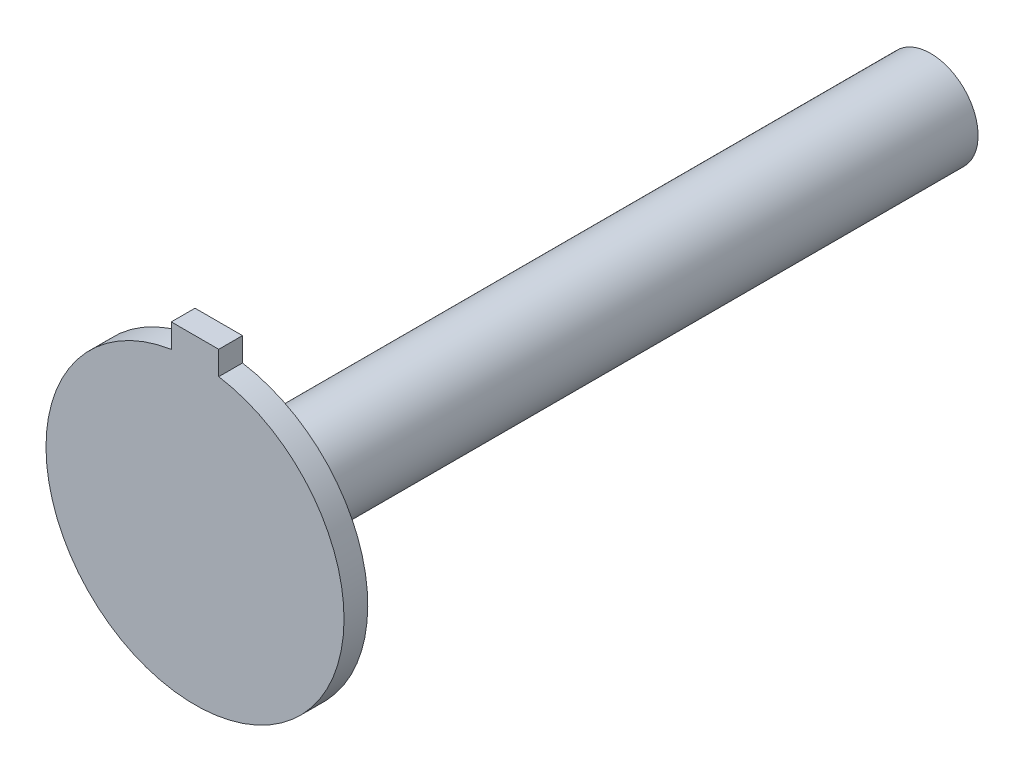
ISO-10303-21;
HEADER;
FILE_DESCRIPTION(('STEP AP214'),'2;1');
FILE_NAME('part.step','',(''),(''),'','','');
FILE_SCHEMA(('AUTOMOTIVE_DESIGN { 1 0 10303 214 1 1 1 1 }'));
ENDSEC;
DATA;
#1=APPLICATION_CONTEXT('core data for automotive mechanical design processes');
#2=APPLICATION_PROTOCOL_DEFINITION('international standard','automotive_design',2000,#1);
#3=PRODUCT_CONTEXT('',#1,'mechanical');
#4=PRODUCT('Part','Part','',(#3));
#5=PRODUCT_RELATED_PRODUCT_CATEGORY('part','',(#4));
#6=PRODUCT_DEFINITION_FORMATION('','',#4);
#7=PRODUCT_DEFINITION_CONTEXT('part definition',#1,'design');
#8=PRODUCT_DEFINITION('design','',#6,#7);
#9=PRODUCT_DEFINITION_SHAPE('','',#8);
#10=(LENGTH_UNIT() NAMED_UNIT(*) SI_UNIT(.MILLI.,.METRE.));
#11=(NAMED_UNIT(*) PLANE_ANGLE_UNIT() SI_UNIT($,.RADIAN.));
#12=(NAMED_UNIT(*) SI_UNIT($,.STERADIAN.) SOLID_ANGLE_UNIT());
#13=UNCERTAINTY_MEASURE_WITH_UNIT(LENGTH_MEASURE(1.E-05),#10,'distance_accuracy_value','');
#14=(GEOMETRIC_REPRESENTATION_CONTEXT(3) GLOBAL_UNCERTAINTY_ASSIGNED_CONTEXT((#13)) GLOBAL_UNIT_ASSIGNED_CONTEXT((#10,
#11,#12)) REPRESENTATION_CONTEXT('',''));
#15=CARTESIAN_POINT('',(0.,0.,0.));
#16=DIRECTION('',(0.,0.,1.));
#17=DIRECTION('',(1.,0.,0.));
#18=AXIS2_PLACEMENT_3D('',#15,#16,#17);
#19=CARTESIAN_POINT('',(0.,0.,0.));
#20=DIRECTION('',(0.,0.,1.));
#21=DIRECTION('',(1.,0.,0.));
#22=AXIS2_PLACEMENT_3D('',#19,#20,#21);
#23=PLANE('',#22);
#24=CARTESIAN_POINT('',(0.,0.,0.));
#25=DIRECTION('',(0.,0.,1.));
#26=DIRECTION('',(1.,0.,0.));
#27=AXIS2_PLACEMENT_3D('',#24,#25,#26);
#28=CIRCLE('',#27,31.4);
#29=CARTESIAN_POINT('',(-5.,30.9993548319961,0.));
#30=VERTEX_POINT('',#29);
#31=CARTESIAN_POINT('',(5.,30.9993548319961,0.));
#32=VERTEX_POINT('',#31);
#33=EDGE_CURVE('E83',#30,#32,#28,.T.);
#34=ORIENTED_EDGE('',*,*,#33,.F.);
#35=DIRECTION('',(0.,-1.,0.));
#36=VECTOR('',#35,1.);
#37=CARTESIAN_POINT('',(-5.,30.9993548319961,0.));
#38=LINE('',#37,#36);
#39=CARTESIAN_POINT('',(-5.,35.9993548319961,0.));
#40=VERTEX_POINT('',#39);
#41=EDGE_CURVE('E89',#40,#30,#38,.T.);
#42=ORIENTED_EDGE('',*,*,#41,.F.);
#43=DIRECTION('',(-1.,0.,0.));
#44=VECTOR('',#43,1.);
#45=CARTESIAN_POINT('',(-5.,35.9993548319961,0.));
#46=LINE('',#45,#44);
#47=CARTESIAN_POINT('',(5.,35.9993548319961,0.));
#48=VERTEX_POINT('',#47);
#49=EDGE_CURVE('E108',#48,#40,#46,.T.);
#50=ORIENTED_EDGE('',*,*,#49,.F.);
#51=DIRECTION('',(0.,1.,0.));
#52=VECTOR('',#51,1.);
#53=CARTESIAN_POINT('',(5.,35.9993548319961,0.));
#54=LINE('',#53,#52);
#55=EDGE_CURVE('E96',#32,#48,#54,.T.);
#56=ORIENTED_EDGE('',*,*,#55,.F.);
#57=EDGE_LOOP('',(#34,#42,#50,#56));
#58=FACE_BOUND('',#57,.T.);
#59=CARTESIAN_POINT('',(0.,0.,0.));
#60=DIRECTION('',(0.,0.,-1.));
#61=DIRECTION('',(-1.,0.,0.));
#62=AXIS2_PLACEMENT_3D('',#59,#60,#61);
#63=CIRCLE('',#62,10.);
#64=CARTESIAN_POINT('',(-10.,0.,0.));
#65=VERTEX_POINT('',#64);
#66=EDGE_CURVE('E11',#65,#65,#63,.T.);
#67=ORIENTED_EDGE('',*,*,#66,.F.);
#68=EDGE_LOOP('',(#67));
#69=FACE_BOUND('',#68,.T.);
#70=ADVANCED_FACE('F33',(#58,#69),#23,.F.);
#71=CARTESIAN_POINT('',(0.,0.,97.1222721808864));
#72=DIRECTION('',(0.,0.,-1.));
#73=DIRECTION('',(-1.,0.,0.));
#74=AXIS2_PLACEMENT_3D('',#71,#72,#73);
#75=CYLINDRICAL_SURFACE('',#74,31.4);
#76=CARTESIAN_POINT('',(0.,0.,5.));
#77=DIRECTION('',(0.,0.,1.));
#78=DIRECTION('',(1.,0.,0.));
#79=AXIS2_PLACEMENT_3D('',#76,#77,#78);
#80=CIRCLE('',#79,31.4);
#81=CARTESIAN_POINT('',(-5.,30.9993548319961,5.));
#82=VERTEX_POINT('',#81);
#83=CARTESIAN_POINT('',(5.,30.9993548319961,5.));
#84=VERTEX_POINT('',#83);
#85=EDGE_CURVE('E85',#82,#84,#80,.T.);
#86=ORIENTED_EDGE('',*,*,#85,.F.);
#87=DIRECTION('',(0.,0.,-1.));
#88=VECTOR('',#87,1.);
#89=CARTESIAN_POINT('',(-5.,30.9993548319961,97.1222721808864));
#90=LINE('',#89,#88);
#91=EDGE_CURVE('E37',#82,#30,#90,.T.);
#92=ORIENTED_EDGE('',*,*,#91,.T.);
#93=ORIENTED_EDGE('',*,*,#33,.T.);
#94=DIRECTION('',(0.,0.,-1.));
#95=VECTOR('',#94,1.);
#96=CARTESIAN_POINT('',(5.,30.9993548319961,97.1222721808864));
#97=LINE('',#96,#95);
#98=EDGE_CURVE('E72',#84,#32,#97,.T.);
#99=ORIENTED_EDGE('',*,*,#98,.F.);
#100=EDGE_LOOP('',(#86,#92,#93,#99));
#101=FACE_BOUND('',#100,.T.);
#102=ADVANCED_FACE('F81',(#101),#75,.T.);
#103=CARTESIAN_POINT('',(5.,35.9993548319961,97.1222721808864));
#104=DIRECTION('',(-1.,0.,0.));
#105=DIRECTION('',(0.,0.,1.));
#106=AXIS2_PLACEMENT_3D('',#103,#104,#105);
#107=PLANE('',#106);
#108=DIRECTION('',(0.,1.,0.));
#109=VECTOR('',#108,1.);
#110=CARTESIAN_POINT('',(5.,35.9993548319961,5.));
#111=LINE('',#110,#109);
#112=CARTESIAN_POINT('',(5.,35.9993548319961,5.));
#113=VERTEX_POINT('',#112);
#114=EDGE_CURVE('E78',#84,#113,#111,.T.);
#115=ORIENTED_EDGE('',*,*,#114,.F.);
#116=ORIENTED_EDGE('',*,*,#98,.T.);
#117=ORIENTED_EDGE('',*,*,#55,.T.);
#118=DIRECTION('',(0.,0.,-1.));
#119=VECTOR('',#118,1.);
#120=CARTESIAN_POINT('',(5.,35.9993548319961,97.1222721808864));
#121=LINE('',#120,#119);
#122=EDGE_CURVE('E107',#113,#48,#121,.T.);
#123=ORIENTED_EDGE('',*,*,#122,.F.);
#124=EDGE_LOOP('',(#115,#116,#117,#123));
#125=FACE_BOUND('',#124,.T.);
#126=ADVANCED_FACE('F126',(#125),#107,.F.);
#127=CARTESIAN_POINT('',(-5.,35.9993548319961,97.1222721808864));
#128=DIRECTION('',(0.,-1.,0.));
#129=DIRECTION('',(0.,0.,-1.));
#130=AXIS2_PLACEMENT_3D('',#127,#128,#129);
#131=PLANE('',#130);
#132=DIRECTION('',(-1.,0.,0.));
#133=VECTOR('',#132,1.);
#134=CARTESIAN_POINT('',(-5.,35.9993548319961,5.));
#135=LINE('',#134,#133);
#136=CARTESIAN_POINT('',(-5.,35.9993548319961,5.));
#137=VERTEX_POINT('',#136);
#138=EDGE_CURVE('E42',#113,#137,#135,.T.);
#139=ORIENTED_EDGE('',*,*,#138,.F.);
#140=ORIENTED_EDGE('',*,*,#122,.T.);
#141=ORIENTED_EDGE('',*,*,#49,.T.);
#142=DIRECTION('',(0.,0.,-1.));
#143=VECTOR('',#142,1.);
#144=CARTESIAN_POINT('',(-5.,35.9993548319961,97.1222721808864));
#145=LINE('',#144,#143);
#146=EDGE_CURVE('E55',#137,#40,#145,.T.);
#147=ORIENTED_EDGE('',*,*,#146,.F.);
#148=EDGE_LOOP('',(#139,#140,#141,#147));
#149=FACE_BOUND('',#148,.T.);
#150=ADVANCED_FACE('F131',(#149),#131,.F.);
#151=CARTESIAN_POINT('',(-5.,30.9993548319961,97.1222721808864));
#152=DIRECTION('',(1.,0.,0.));
#153=DIRECTION('',(0.,0.,-1.));
#154=AXIS2_PLACEMENT_3D('',#151,#152,#153);
#155=PLANE('',#154);
#156=DIRECTION('',(0.,-1.,0.));
#157=VECTOR('',#156,1.);
#158=CARTESIAN_POINT('',(-5.,30.9993548319961,5.));
#159=LINE('',#158,#157);
#160=EDGE_CURVE('E93',#137,#82,#159,.T.);
#161=ORIENTED_EDGE('',*,*,#160,.F.);
#162=ORIENTED_EDGE('',*,*,#146,.T.);
#163=ORIENTED_EDGE('',*,*,#41,.T.);
#164=ORIENTED_EDGE('',*,*,#91,.F.);
#165=EDGE_LOOP('',(#161,#162,#163,#164));
#166=FACE_BOUND('',#165,.T.);
#167=ADVANCED_FACE('F90',(#166),#155,.F.);
#168=CARTESIAN_POINT('',(0.,33.4,5.));
#169=DIRECTION('',(0.,0.,1.));
#170=DIRECTION('',(1.,0.,0.));
#171=AXIS2_PLACEMENT_3D('',#168,#169,#170);
#172=PLANE('',#171);
#173=ORIENTED_EDGE('',*,*,#160,.T.);
#174=ORIENTED_EDGE('',*,*,#85,.T.);
#175=ORIENTED_EDGE('',*,*,#114,.T.);
#176=ORIENTED_EDGE('',*,*,#138,.T.);
#177=EDGE_LOOP('',(#173,#174,#175,#176));
#178=FACE_BOUND('',#177,.T.);
#179=ADVANCED_FACE('F35',(#178),#172,.T.);
#180=CARTESIAN_POINT('',(0.,0.,-150.));
#181=DIRECTION('',(0.,0.,1.));
#182=DIRECTION('',(1.,0.,0.));
#183=AXIS2_PLACEMENT_3D('',#180,#181,#182);
#184=CYLINDRICAL_SURFACE('',#183,10.);
#185=CARTESIAN_POINT('',(0.,0.,-150.));
#186=DIRECTION('',(0.,0.,-1.));
#187=DIRECTION('',(-1.,0.,0.));
#188=AXIS2_PLACEMENT_3D('',#185,#186,#187);
#189=CIRCLE('',#188,10.);
#190=CARTESIAN_POINT('',(-10.,0.,-150.));
#191=VERTEX_POINT('',#190);
#192=EDGE_CURVE('E87',#191,#191,#189,.T.);
#193=ORIENTED_EDGE('',*,*,#192,.F.);
#194=EDGE_LOOP('',(#193));
#195=FACE_BOUND('',#194,.T.);
#196=ORIENTED_EDGE('',*,*,#66,.T.);
#197=EDGE_LOOP('',(#196));
#198=FACE_BOUND('',#197,.T.);
#199=ADVANCED_FACE('F116',(#195,#198),#184,.T.);
#200=CARTESIAN_POINT('',(0.,0.,-150.));
#201=DIRECTION('',(0.,0.,-1.));
#202=DIRECTION('',(-1.,0.,0.));
#203=AXIS2_PLACEMENT_3D('',#200,#201,#202);
#204=PLANE('',#203);
#205=ORIENTED_EDGE('',*,*,#192,.T.);
#206=EDGE_LOOP('',(#205));
#207=FACE_BOUND('',#206,.T.);
#208=ADVANCED_FACE('F114',(#207),#204,.T.);
#209=CLOSED_SHELL('',(#70,#102,#126,#150,#167,#179,#199,#208));
#210=MANIFOLD_SOLID_BREP('B2',#209);
#211=ADVANCED_BREP_SHAPE_REPRESENTATION('',(#18,#210),#14);
#212=SHAPE_DEFINITION_REPRESENTATION(#9,#211);
ENDSEC;
END-ISO-10303-21;
